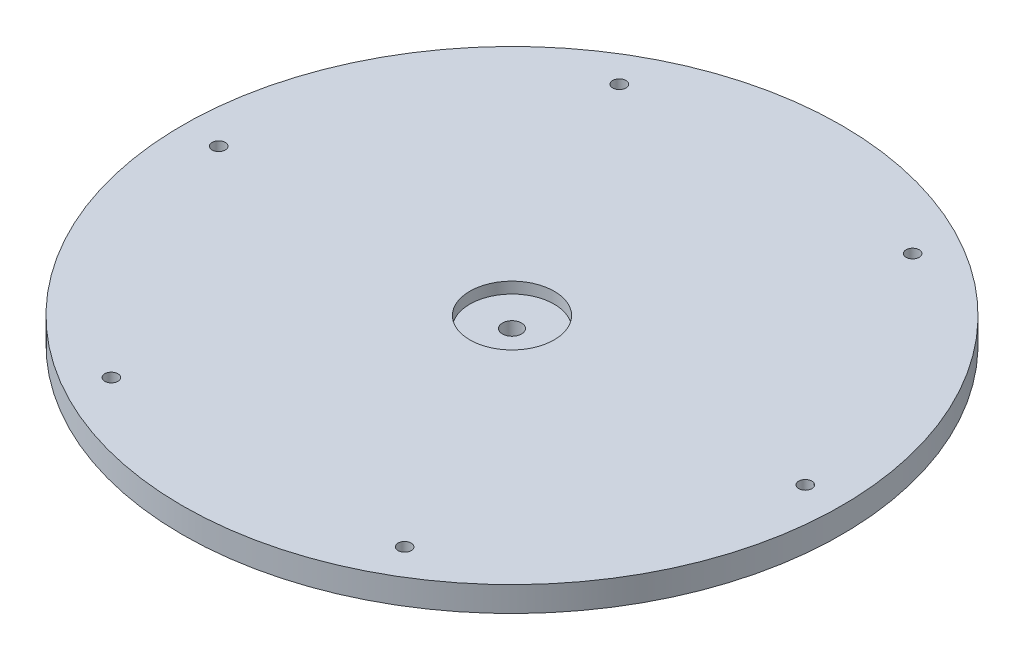
ISO-10303-21;
HEADER;
FILE_DESCRIPTION(('STEP AP214'),'2;1');
FILE_NAME('part.step','',(''),(''),'','','');
FILE_SCHEMA(('AUTOMOTIVE_DESIGN { 1 0 10303 214 1 1 1 1 }'));
ENDSEC;
DATA;
#1=APPLICATION_CONTEXT('core data for automotive mechanical design processes');
#2=APPLICATION_PROTOCOL_DEFINITION('international standard','automotive_design',2000,#1);
#3=PRODUCT_CONTEXT('',#1,'mechanical');
#4=PRODUCT('Part','Part','',(#3));
#5=PRODUCT_RELATED_PRODUCT_CATEGORY('part','',(#4));
#6=PRODUCT_DEFINITION_FORMATION('','',#4);
#7=PRODUCT_DEFINITION_CONTEXT('part definition',#1,'design');
#8=PRODUCT_DEFINITION('design','',#6,#7);
#9=PRODUCT_DEFINITION_SHAPE('','',#8);
#10=(LENGTH_UNIT() NAMED_UNIT(*) SI_UNIT(.MILLI.,.METRE.));
#11=(NAMED_UNIT(*) PLANE_ANGLE_UNIT() SI_UNIT($,.RADIAN.));
#12=(NAMED_UNIT(*) SI_UNIT($,.STERADIAN.) SOLID_ANGLE_UNIT());
#13=UNCERTAINTY_MEASURE_WITH_UNIT(LENGTH_MEASURE(1.E-05),#10,'distance_accuracy_value','');
#14=(GEOMETRIC_REPRESENTATION_CONTEXT(3) GLOBAL_UNCERTAINTY_ASSIGNED_CONTEXT((#13)) GLOBAL_UNIT_ASSIGNED_CONTEXT((#10,
#11,#12)) REPRESENTATION_CONTEXT('',''));
#15=CARTESIAN_POINT('',(0.,0.,0.));
#16=DIRECTION('',(0.,0.,1.));
#17=DIRECTION('',(1.,0.,0.));
#18=AXIS2_PLACEMENT_3D('',#15,#16,#17);
#19=CARTESIAN_POINT('',(0.,9.5,0.));
#20=DIRECTION('',(0.,-1.,0.));
#21=DIRECTION('',(0.,0.,-1.));
#22=AXIS2_PLACEMENT_3D('',#19,#20,#21);
#23=CYLINDRICAL_SURFACE('',#22,7.25);
#24=CARTESIAN_POINT('',(0.,-9.5,0.));
#25=DIRECTION('',(0.,1.,0.));
#26=DIRECTION('',(0.,0.,1.));
#27=AXIS2_PLACEMENT_3D('',#24,#25,#26);
#28=CIRCLE('',#27,7.25);
#29=CARTESIAN_POINT('',(0.,-9.5,7.25));
#30=VERTEX_POINT('',#29);
#31=EDGE_CURVE('E44',#30,#30,#28,.T.);
#32=ORIENTED_EDGE('',*,*,#31,.F.);
#33=EDGE_LOOP('',(#32));
#34=FACE_BOUND('',#33,.T.);
#35=CARTESIAN_POINT('',(0.,0.999999999999999,0.));
#36=DIRECTION('',(0.,1.,0.));
#37=DIRECTION('',(0.,0.,1.));
#38=AXIS2_PLACEMENT_3D('',#35,#36,#37);
#39=CIRCLE('',#38,7.25);
#40=CARTESIAN_POINT('',(0.,0.999999999999999,7.25));
#41=VERTEX_POINT('',#40);
#42=EDGE_CURVE('E35',#41,#41,#39,.T.);
#43=ORIENTED_EDGE('',*,*,#42,.T.);
#44=EDGE_LOOP('',(#43));
#45=FACE_BOUND('',#44,.T.);
#46=ADVANCED_FACE('F31',(#34,#45),#23,.F.);
#47=CARTESIAN_POINT('',(0.,9.5,0.));
#48=DIRECTION('',(0.,1.,0.));
#49=DIRECTION('',(0.,0.,1.));
#50=AXIS2_PLACEMENT_3D('',#47,#48,#49);
#51=PLANE('',#50);
#52=CARTESIAN_POINT('',(-111.250000000001,9.5,192.690652342037));
#53=DIRECTION('',(0.,-1.,0.));
#54=DIRECTION('',(0.,0.,-1.));
#55=AXIS2_PLACEMENT_3D('',#52,#53,#54);
#56=CIRCLE('',#55,4.99999999999996);
#57=CARTESIAN_POINT('',(-111.250000000001,9.5,187.690652342037));
#58=VERTEX_POINT('',#57);
#59=EDGE_CURVE('E76',#58,#58,#56,.T.);
#60=ORIENTED_EDGE('',*,*,#59,.T.);
#61=EDGE_LOOP('',(#60));
#62=FACE_BOUND('',#61,.T.);
#63=CARTESIAN_POINT('',(-222.5,9.5,1.16573417585641E-12));
#64=DIRECTION('',(0.,-1.,0.));
#65=DIRECTION('',(0.,0.,1.));
#66=AXIS2_PLACEMENT_3D('',#63,#64,#65);
#67=CIRCLE('',#66,5.00000000000013);
#68=CARTESIAN_POINT('',(-222.5,9.5,5.0000000000013));
#69=VERTEX_POINT('',#68);
#70=EDGE_CURVE('E65',#69,#69,#67,.T.);
#71=ORIENTED_EDGE('',*,*,#70,.T.);
#72=EDGE_LOOP('',(#71));
#73=FACE_BOUND('',#72,.T.);
#74=CARTESIAN_POINT('',(-111.250000000001,9.5,-192.690652342037));
#75=DIRECTION('',(0.,-1.,0.));
#76=DIRECTION('',(0.,0.,1.));
#77=AXIS2_PLACEMENT_3D('',#74,#75,#76);
#78=CIRCLE('',#77,4.99999999999996);
#79=CARTESIAN_POINT('',(-111.250000000001,9.5,-187.690652342037));
#80=VERTEX_POINT('',#79);
#81=EDGE_CURVE('E64',#80,#80,#78,.T.);
#82=ORIENTED_EDGE('',*,*,#81,.T.);
#83=EDGE_LOOP('',(#82));
#84=FACE_BOUND('',#83,.T.);
#85=CARTESIAN_POINT('',(222.5,9.5,0.));
#86=DIRECTION('',(0.,-1.,0.));
#87=DIRECTION('',(0.,0.,-1.));
#88=AXIS2_PLACEMENT_3D('',#85,#86,#87);
#89=CIRCLE('',#88,4.99999999999999);
#90=CARTESIAN_POINT('',(222.5,9.5,-4.99999999999999));
#91=VERTEX_POINT('',#90);
#92=EDGE_CURVE('E58',#91,#91,#89,.T.);
#93=ORIENTED_EDGE('',*,*,#92,.T.);
#94=EDGE_LOOP('',(#93));
#95=FACE_BOUND('',#94,.T.);
#96=CARTESIAN_POINT('',(111.250000000002,9.5,-192.690652342036));
#97=DIRECTION('',(0.,-1.,0.));
#98=DIRECTION('',(0.,0.,-1.));
#99=AXIS2_PLACEMENT_3D('',#96,#97,#98);
#100=CIRCLE('',#99,4.99999999999983);
#101=CARTESIAN_POINT('',(111.250000000002,9.5,-197.690652342036));
#102=VERTEX_POINT('',#101);
#103=EDGE_CURVE('E77',#102,#102,#100,.T.);
#104=ORIENTED_EDGE('',*,*,#103,.T.);
#105=EDGE_LOOP('',(#104));
#106=FACE_BOUND('',#105,.T.);
#107=CARTESIAN_POINT('',(111.25,9.5,192.690652342038));
#108=DIRECTION('',(0.,-1.,0.));
#109=DIRECTION('',(0.,0.,-1.));
#110=AXIS2_PLACEMENT_3D('',#107,#108,#109);
#111=CIRCLE('',#110,5.00000000000001);
#112=CARTESIAN_POINT('',(111.25,9.5,187.690652342038));
#113=VERTEX_POINT('',#112);
#114=EDGE_CURVE('E52',#113,#113,#111,.T.);
#115=ORIENTED_EDGE('',*,*,#114,.T.);
#116=EDGE_LOOP('',(#115));
#117=FACE_BOUND('',#116,.T.);
#118=CARTESIAN_POINT('',(0.,9.5,0.));
#119=DIRECTION('',(0.,1.,0.));
#120=DIRECTION('',(0.,0.,1.));
#121=AXIS2_PLACEMENT_3D('',#118,#119,#120);
#122=CIRCLE('',#121,32.);
#123=CARTESIAN_POINT('',(0.,9.5,32.));
#124=VERTEX_POINT('',#123);
#125=EDGE_CURVE('E48',#124,#124,#122,.T.);
#126=ORIENTED_EDGE('',*,*,#125,.F.);
#127=EDGE_LOOP('',(#126));
#128=FACE_BOUND('',#127,.T.);
#129=CARTESIAN_POINT('',(0.,9.5,0.));
#130=DIRECTION('',(0.,1.,0.));
#131=DIRECTION('',(0.,0.,1.));
#132=AXIS2_PLACEMENT_3D('',#129,#130,#131);
#133=CIRCLE('',#132,250.);
#134=CARTESIAN_POINT('',(0.,9.5,250.));
#135=VERTEX_POINT('',#134);
#136=EDGE_CURVE('E10',#135,#135,#133,.T.);
#137=ORIENTED_EDGE('',*,*,#136,.T.);
#138=EDGE_LOOP('',(#137));
#139=FACE_BOUND('',#138,.T.);
#140=ADVANCED_FACE('F91',(#62,#73,#84,#95,#106,#117,#128,#139),#51,.T.);
#141=CARTESIAN_POINT('',(0.,-9.5,0.));
#142=DIRECTION('',(0.,1.,0.));
#143=DIRECTION('',(0.,0.,1.));
#144=AXIS2_PLACEMENT_3D('',#141,#142,#143);
#145=PLANE('',#144);
#146=CARTESIAN_POINT('',(-111.250000000001,-9.5,192.690652342037));
#147=DIRECTION('',(0.,-1.,0.));
#148=DIRECTION('',(0.,0.,-1.));
#149=AXIS2_PLACEMENT_3D('',#146,#147,#148);
#150=CIRCLE('',#149,4.99999999999996);
#151=CARTESIAN_POINT('',(-111.250000000001,-9.5,187.690652342037));
#152=VERTEX_POINT('',#151);
#153=EDGE_CURVE('E73',#152,#152,#150,.T.);
#154=ORIENTED_EDGE('',*,*,#153,.F.);
#155=EDGE_LOOP('',(#154));
#156=FACE_BOUND('',#155,.T.);
#157=CARTESIAN_POINT('',(-222.5,-9.5,1.16573417585641E-12));
#158=DIRECTION('',(0.,-1.,0.));
#159=DIRECTION('',(0.,0.,1.));
#160=AXIS2_PLACEMENT_3D('',#157,#158,#159);
#161=CIRCLE('',#160,5.00000000000013);
#162=CARTESIAN_POINT('',(-222.5,-9.5,5.0000000000013));
#163=VERTEX_POINT('',#162);
#164=EDGE_CURVE('E80',#163,#163,#161,.T.);
#165=ORIENTED_EDGE('',*,*,#164,.F.);
#166=EDGE_LOOP('',(#165));
#167=FACE_BOUND('',#166,.T.);
#168=CARTESIAN_POINT('',(-111.250000000001,-9.5,-192.690652342037));
#169=DIRECTION('',(0.,-1.,0.));
#170=DIRECTION('',(0.,0.,1.));
#171=AXIS2_PLACEMENT_3D('',#168,#169,#170);
#172=CIRCLE('',#171,4.99999999999996);
#173=CARTESIAN_POINT('',(-111.250000000001,-9.5,-187.690652342037));
#174=VERTEX_POINT('',#173);
#175=EDGE_CURVE('E61',#174,#174,#172,.T.);
#176=ORIENTED_EDGE('',*,*,#175,.F.);
#177=EDGE_LOOP('',(#176));
#178=FACE_BOUND('',#177,.T.);
#179=CARTESIAN_POINT('',(222.5,-9.5,0.));
#180=DIRECTION('',(0.,-1.,0.));
#181=DIRECTION('',(0.,0.,-1.));
#182=AXIS2_PLACEMENT_3D('',#179,#180,#181);
#183=CIRCLE('',#182,4.99999999999999);
#184=CARTESIAN_POINT('',(222.5,-9.5,-4.99999999999999));
#185=VERTEX_POINT('',#184);
#186=EDGE_CURVE('E68',#185,#185,#183,.T.);
#187=ORIENTED_EDGE('',*,*,#186,.F.);
#188=EDGE_LOOP('',(#187));
#189=FACE_BOUND('',#188,.T.);
#190=CARTESIAN_POINT('',(111.250000000002,-9.5,-192.690652342036));
#191=DIRECTION('',(0.,-1.,0.));
#192=DIRECTION('',(0.,0.,-1.));
#193=AXIS2_PLACEMENT_3D('',#190,#191,#192);
#194=CIRCLE('',#193,4.99999999999983);
#195=CARTESIAN_POINT('',(111.250000000002,-9.5,-197.690652342036));
#196=VERTEX_POINT('',#195);
#197=EDGE_CURVE('E85',#196,#196,#194,.T.);
#198=ORIENTED_EDGE('',*,*,#197,.F.);
#199=EDGE_LOOP('',(#198));
#200=FACE_BOUND('',#199,.T.);
#201=CARTESIAN_POINT('',(111.25,-9.5,192.690652342038));
#202=DIRECTION('',(0.,-1.,0.));
#203=DIRECTION('',(0.,0.,-1.));
#204=AXIS2_PLACEMENT_3D('',#201,#202,#203);
#205=CIRCLE('',#204,5.00000000000001);
#206=CARTESIAN_POINT('',(111.25,-9.5,187.690652342038));
#207=VERTEX_POINT('',#206);
#208=EDGE_CURVE('E55',#207,#207,#205,.T.);
#209=ORIENTED_EDGE('',*,*,#208,.F.);
#210=EDGE_LOOP('',(#209));
#211=FACE_BOUND('',#210,.T.);
#212=CARTESIAN_POINT('',(0.,-9.5,0.));
#213=DIRECTION('',(0.,1.,0.));
#214=DIRECTION('',(0.,0.,1.));
#215=AXIS2_PLACEMENT_3D('',#212,#213,#214);
#216=CIRCLE('',#215,250.);
#217=CARTESIAN_POINT('',(0.,-9.5,250.));
#218=VERTEX_POINT('',#217);
#219=EDGE_CURVE('E39',#218,#218,#216,.T.);
#220=ORIENTED_EDGE('',*,*,#219,.F.);
#221=EDGE_LOOP('',(#220));
#222=FACE_BOUND('',#221,.T.);
#223=ORIENTED_EDGE('',*,*,#31,.T.);
#224=EDGE_LOOP('',(#223));
#225=FACE_BOUND('',#224,.T.);
#226=ADVANCED_FACE('F102',(#156,#167,#178,#189,#200,#211,#222,#225),#145,.F.);
#227=CARTESIAN_POINT('',(0.,9.5,0.));
#228=DIRECTION('',(0.,-1.,0.));
#229=DIRECTION('',(0.,0.,-1.));
#230=AXIS2_PLACEMENT_3D('',#227,#228,#229);
#231=CYLINDRICAL_SURFACE('',#230,250.);
#232=ORIENTED_EDGE('',*,*,#136,.F.);
#233=EDGE_LOOP('',(#232));
#234=FACE_BOUND('',#233,.T.);
#235=ORIENTED_EDGE('',*,*,#219,.T.);
#236=EDGE_LOOP('',(#235));
#237=FACE_BOUND('',#236,.T.);
#238=ADVANCED_FACE('F33',(#234,#237),#231,.T.);
#239=CARTESIAN_POINT('',(0.,0.999999999999999,0.));
#240=DIRECTION('',(0.,1.,0.));
#241=DIRECTION('',(0.,0.,1.));
#242=AXIS2_PLACEMENT_3D('',#239,#240,#241);
#243=CYLINDRICAL_SURFACE('',#242,32.);
#244=CARTESIAN_POINT('',(0.,0.999999999999999,0.));
#245=DIRECTION('',(0.,1.,0.));
#246=DIRECTION('',(0.,0.,1.));
#247=AXIS2_PLACEMENT_3D('',#244,#245,#246);
#248=CIRCLE('',#247,32.);
#249=CARTESIAN_POINT('',(0.,0.999999999999999,32.));
#250=VERTEX_POINT('',#249);
#251=EDGE_CURVE('E51',#250,#250,#248,.T.);
#252=ORIENTED_EDGE('',*,*,#251,.F.);
#253=EDGE_LOOP('',(#252));
#254=FACE_BOUND('',#253,.T.);
#255=ORIENTED_EDGE('',*,*,#125,.T.);
#256=EDGE_LOOP('',(#255));
#257=FACE_BOUND('',#256,.T.);
#258=ADVANCED_FACE('F121',(#254,#257),#243,.F.);
#259=CARTESIAN_POINT('',(0.,0.999999999999999,0.));
#260=DIRECTION('',(0.,1.,0.));
#261=DIRECTION('',(0.,0.,1.));
#262=AXIS2_PLACEMENT_3D('',#259,#260,#261);
#263=PLANE('',#262);
#264=ORIENTED_EDGE('',*,*,#42,.F.);
#265=EDGE_LOOP('',(#264));
#266=FACE_BOUND('',#265,.T.);
#267=ORIENTED_EDGE('',*,*,#251,.T.);
#268=EDGE_LOOP('',(#267));
#269=FACE_BOUND('',#268,.T.);
#270=ADVANCED_FACE('F118',(#266,#269),#263,.T.);
#271=CARTESIAN_POINT('',(111.25,9.5,192.690652342038));
#272=DIRECTION('',(0.,-1.,0.));
#273=DIRECTION('',(0.,0.,-1.));
#274=AXIS2_PLACEMENT_3D('',#271,#272,#273);
#275=CYLINDRICAL_SURFACE('',#274,5.00000000000001);
#276=ORIENTED_EDGE('',*,*,#114,.F.);
#277=EDGE_LOOP('',(#276));
#278=FACE_BOUND('',#277,.T.);
#279=ORIENTED_EDGE('',*,*,#208,.T.);
#280=EDGE_LOOP('',(#279));
#281=FACE_BOUND('',#280,.T.);
#282=ADVANCED_FACE('F98',(#278,#281),#275,.F.);
#283=CARTESIAN_POINT('',(111.250000000002,9.5,-192.690652342036));
#284=DIRECTION('',(0.,-1.,0.));
#285=DIRECTION('',(0.,0.,-1.));
#286=AXIS2_PLACEMENT_3D('',#283,#284,#285);
#287=CYLINDRICAL_SURFACE('',#286,4.99999999999983);
#288=ORIENTED_EDGE('',*,*,#103,.F.);
#289=EDGE_LOOP('',(#288));
#290=FACE_BOUND('',#289,.T.);
#291=ORIENTED_EDGE('',*,*,#197,.T.);
#292=EDGE_LOOP('',(#291));
#293=FACE_BOUND('',#292,.T.);
#294=ADVANCED_FACE('F94',(#290,#293),#287,.F.);
#295=CARTESIAN_POINT('',(222.5,9.5,0.));
#296=DIRECTION('',(0.,-1.,0.));
#297=DIRECTION('',(0.,0.,-1.));
#298=AXIS2_PLACEMENT_3D('',#295,#296,#297);
#299=CYLINDRICAL_SURFACE('',#298,4.99999999999999);
#300=ORIENTED_EDGE('',*,*,#92,.F.);
#301=EDGE_LOOP('',(#300));
#302=FACE_BOUND('',#301,.T.);
#303=ORIENTED_EDGE('',*,*,#186,.T.);
#304=EDGE_LOOP('',(#303));
#305=FACE_BOUND('',#304,.T.);
#306=ADVANCED_FACE('F97',(#302,#305),#299,.F.);
#307=CARTESIAN_POINT('',(-111.250000000001,9.5,-192.690652342037));
#308=DIRECTION('',(0.,-1.,0.));
#309=DIRECTION('',(0.,0.,-1.));
#310=AXIS2_PLACEMENT_3D('',#307,#308,#309);
#311=CYLINDRICAL_SURFACE('',#310,4.99999999999996);
#312=ORIENTED_EDGE('',*,*,#81,.F.);
#313=EDGE_LOOP('',(#312));
#314=FACE_BOUND('',#313,.T.);
#315=ORIENTED_EDGE('',*,*,#175,.T.);
#316=EDGE_LOOP('',(#315));
#317=FACE_BOUND('',#316,.T.);
#318=ADVANCED_FACE('F140',(#314,#317),#311,.F.);
#319=CARTESIAN_POINT('',(-222.5,9.5,1.16573417585641E-12));
#320=DIRECTION('',(0.,-1.,0.));
#321=DIRECTION('',(0.,0.,-1.));
#322=AXIS2_PLACEMENT_3D('',#319,#320,#321);
#323=CYLINDRICAL_SURFACE('',#322,5.00000000000013);
#324=ORIENTED_EDGE('',*,*,#70,.F.);
#325=EDGE_LOOP('',(#324));
#326=FACE_BOUND('',#325,.T.);
#327=ORIENTED_EDGE('',*,*,#164,.T.);
#328=EDGE_LOOP('',(#327));
#329=FACE_BOUND('',#328,.T.);
#330=ADVANCED_FACE('F143',(#326,#329),#323,.F.);
#331=CARTESIAN_POINT('',(-111.250000000001,9.5,192.690652342037));
#332=DIRECTION('',(0.,-1.,0.));
#333=DIRECTION('',(0.,0.,-1.));
#334=AXIS2_PLACEMENT_3D('',#331,#332,#333);
#335=CYLINDRICAL_SURFACE('',#334,4.99999999999996);
#336=ORIENTED_EDGE('',*,*,#59,.F.);
#337=EDGE_LOOP('',(#336));
#338=FACE_BOUND('',#337,.T.);
#339=ORIENTED_EDGE('',*,*,#153,.T.);
#340=EDGE_LOOP('',(#339));
#341=FACE_BOUND('',#340,.T.);
#342=ADVANCED_FACE('F148',(#338,#341),#335,.F.);
#343=CLOSED_SHELL('',(#46,#140,#226,#238,#258,#270,#282,#294,#306,#318,#330,#342));
#344=MANIFOLD_SOLID_BREP('B2',#343);
#345=ADVANCED_BREP_SHAPE_REPRESENTATION('',(#18,#344),#14);
#346=SHAPE_DEFINITION_REPRESENTATION(#9,#345);
ENDSEC;
END-ISO-10303-21;
